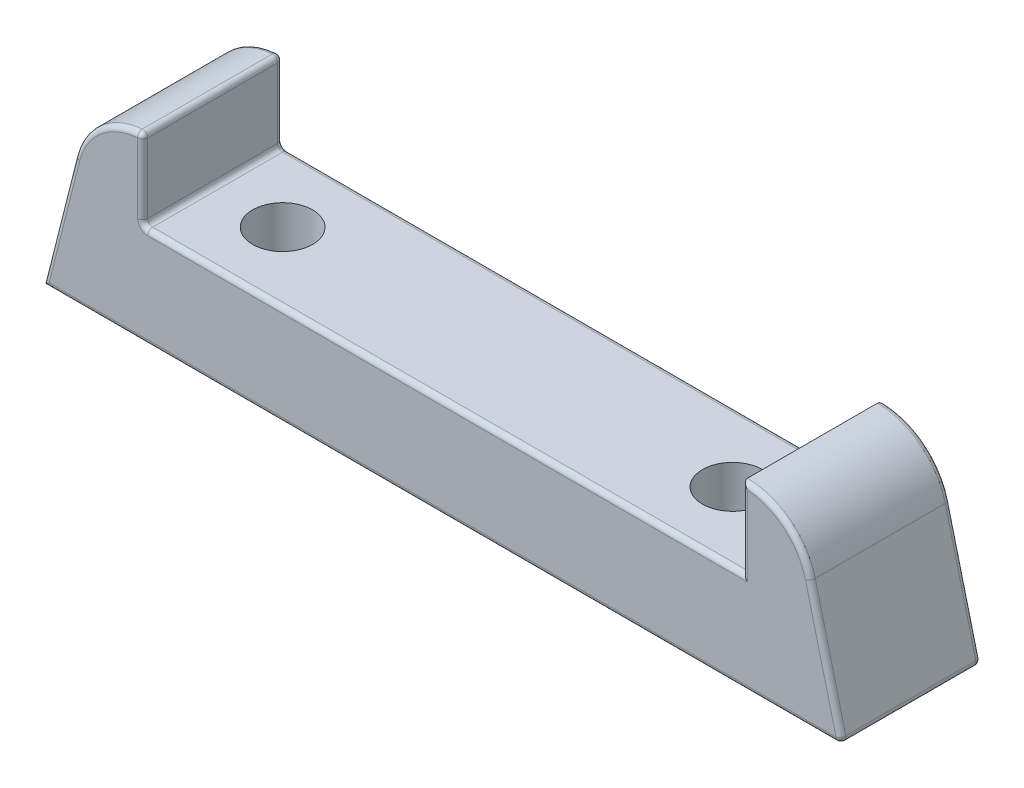
ISO-10303-21;
HEADER;
FILE_DESCRIPTION(('STEP AP214'),'2;1');
FILE_NAME('part.step','',(''),(''),'','','');
FILE_SCHEMA(('AUTOMOTIVE_DESIGN { 1 0 10303 214 1 1 1 1 }'));
ENDSEC;
DATA;
#1=APPLICATION_CONTEXT('core data for automotive mechanical design processes');
#2=APPLICATION_PROTOCOL_DEFINITION('international standard','automotive_design',2000,#1);
#3=PRODUCT_CONTEXT('',#1,'mechanical');
#4=PRODUCT('Part','Part','',(#3));
#5=PRODUCT_RELATED_PRODUCT_CATEGORY('part','',(#4));
#6=PRODUCT_DEFINITION_FORMATION('','',#4);
#7=PRODUCT_DEFINITION_CONTEXT('part definition',#1,'design');
#8=PRODUCT_DEFINITION('design','',#6,#7);
#9=PRODUCT_DEFINITION_SHAPE('','',#8);
#10=(LENGTH_UNIT() NAMED_UNIT(*) SI_UNIT(.MILLI.,.METRE.));
#11=(NAMED_UNIT(*) PLANE_ANGLE_UNIT() SI_UNIT($,.RADIAN.));
#12=(NAMED_UNIT(*) SI_UNIT($,.STERADIAN.) SOLID_ANGLE_UNIT());
#13=UNCERTAINTY_MEASURE_WITH_UNIT(LENGTH_MEASURE(1.E-05),#10,'distance_accuracy_value','');
#14=(GEOMETRIC_REPRESENTATION_CONTEXT(3) GLOBAL_UNCERTAINTY_ASSIGNED_CONTEXT((#13)) GLOBAL_UNIT_ASSIGNED_CONTEXT((#10,
#11,#12)) REPRESENTATION_CONTEXT('',''));
#15=CARTESIAN_POINT('',(0.,0.,0.));
#16=DIRECTION('',(0.,0.,1.));
#17=DIRECTION('',(1.,0.,0.));
#18=AXIS2_PLACEMENT_3D('',#15,#16,#17);
#19=CARTESIAN_POINT('',(-36.7866313698756,12.7151194271596,7.));
#20=DIRECTION('',(0.969518767125086,-0.245017061022806,0.));
#21=DIRECTION('',(0.245017061022806,0.969518767125086,0.));
#22=AXIS2_PLACEMENT_3D('',#19,#20,#21);
#23=PLANE('',#22);
#24=DIRECTION('',(0.,0.,-1.));
#25=VECTOR('',#24,1.);
#26=CARTESIAN_POINT('',(-36.7866313698756,12.7151194271596,7.));
#27=LINE('',#26,#25);
#28=CARTESIAN_POINT('',(-36.7866313698756,12.7151194271596,6.5));
#29=VERTEX_POINT('',#28);
#30=CARTESIAN_POINT('',(-36.7866313698756,12.7151194271596,-6.5));
#31=VERTEX_POINT('',#30);
#32=EDGE_CURVE('E490',#29,#31,#27,.T.);
#33=ORIENTED_EDGE('',*,*,#32,.T.);
#34=DIRECTION('',(-0.245017061022806,-0.969518767125086,0.));
#35=VECTOR('',#34,1.);
#36=CARTESIAN_POINT('',(-40.,0.,-6.5));
#37=LINE('',#36,#35);
#38=CARTESIAN_POINT('',(-40.,0.,-6.5));
#39=VERTEX_POINT('',#38);
#40=EDGE_CURVE('E192',#31,#39,#37,.T.);
#41=ORIENTED_EDGE('',*,*,#40,.T.);
#42=DIRECTION('',(0.,0.,-1.));
#43=VECTOR('',#42,1.);
#44=CARTESIAN_POINT('',(-40.,0.,7.));
#45=LINE('',#44,#43);
#46=CARTESIAN_POINT('',(-40.,0.,6.5));
#47=VERTEX_POINT('',#46);
#48=EDGE_CURVE('E177',#47,#39,#45,.T.);
#49=ORIENTED_EDGE('',*,*,#48,.F.);
#50=DIRECTION('',(-0.245017061022806,-0.969518767125086,0.));
#51=VECTOR('',#50,1.);
#52=CARTESIAN_POINT('',(-36.7866313698756,12.7151194271596,6.5));
#53=LINE('',#52,#51);
#54=EDGE_CURVE('E189',#47,#29,#53,.F.);
#55=ORIENTED_EDGE('',*,*,#54,.T.);
#56=EDGE_LOOP('',(#33,#41,#49,#55));
#57=FACE_BOUND('',#56,.T.);
#58=ADVANCED_FACE('F37',(#57),#23,.F.);
#59=CARTESIAN_POINT('',(-40.,0.,7.));
#60=DIRECTION('',(0.,1.,0.));
#61=DIRECTION('',(0.,0.,1.));
#62=AXIS2_PLACEMENT_3D('',#59,#60,#61);
#63=PLANE('',#62);
#64=CARTESIAN_POINT('',(-23.,0.,0.));
#65=DIRECTION('',(0.,1.,0.));
#66=DIRECTION('',(0.,0.,1.));
#67=AXIS2_PLACEMENT_3D('',#64,#65,#66);
#68=CIRCLE('',#67,3.);
#69=CARTESIAN_POINT('',(-23.,0.,3.));
#70=VERTEX_POINT('',#69);
#71=EDGE_CURVE('E529',#70,#70,#68,.T.);
#72=ORIENTED_EDGE('',*,*,#71,.T.);
#73=EDGE_LOOP('',(#72));
#74=FACE_BOUND('',#73,.T.);
#75=CARTESIAN_POINT('',(22.,0.,0.));
#76=DIRECTION('',(0.,1.,0.));
#77=DIRECTION('',(0.,0.,1.));
#78=AXIS2_PLACEMENT_3D('',#75,#76,#77);
#79=CIRCLE('',#78,3.);
#80=CARTESIAN_POINT('',(22.,0.,2.99999999999999));
#81=VERTEX_POINT('',#80);
#82=EDGE_CURVE('E531',#81,#81,#79,.T.);
#83=ORIENTED_EDGE('',*,*,#82,.T.);
#84=EDGE_LOOP('',(#83));
#85=FACE_BOUND('',#84,.T.);
#86=ORIENTED_EDGE('',*,*,#48,.T.);
#87=DIRECTION('',(1.,0.,0.));
#88=VECTOR('',#87,1.);
#89=CARTESIAN_POINT('',(40.,0.,-6.5));
#90=LINE('',#89,#88);
#91=CARTESIAN_POINT('',(39.3579200819832,0.,-6.5));
#92=VERTEX_POINT('',#91);
#93=EDGE_CURVE('E432',#39,#92,#90,.T.);
#94=ORIENTED_EDGE('',*,*,#93,.T.);
#95=DIRECTION('',(0.,0.,-1.));
#96=VECTOR('',#95,1.);
#97=CARTESIAN_POINT('',(39.3579200819832,0.,7.));
#98=LINE('',#97,#96);
#99=CARTESIAN_POINT('',(39.3579200819832,0.,6.5));
#100=VERTEX_POINT('',#99);
#101=EDGE_CURVE('E180',#92,#100,#98,.F.);
#102=ORIENTED_EDGE('',*,*,#101,.T.);
#103=DIRECTION('',(1.,0.,0.));
#104=VECTOR('',#103,1.);
#105=CARTESIAN_POINT('',(-40.,0.,6.5));
#106=LINE('',#105,#104);
#107=EDGE_CURVE('E173',#100,#47,#106,.F.);
#108=ORIENTED_EDGE('',*,*,#107,.T.);
#109=EDGE_LOOP('',(#86,#94,#102,#108));
#110=FACE_BOUND('',#109,.T.);
#111=ADVANCED_FACE('F175',(#74,#85,#110),#63,.F.);
#112=CARTESIAN_POINT('',(36.7866313698756,12.7151194271596,7.));
#113=DIRECTION('',(-0.969518767125086,-0.245017061022806,0.));
#114=DIRECTION('',(0.245017061022806,-0.969518767125086,0.));
#115=AXIS2_PLACEMENT_3D('',#112,#113,#114);
#116=PLANE('',#115);
#117=DIRECTION('',(0.,0.,-1.));
#118=VECTOR('',#117,1.);
#119=CARTESIAN_POINT('',(39.8426794655458,0.622508530511405,7.));
#120=LINE('',#119,#118);
#121=CARTESIAN_POINT('',(39.8426794655458,0.622508530511403,6.5));
#122=VERTEX_POINT('',#121);
#123=CARTESIAN_POINT('',(39.8426794655458,0.622508530511403,-6.5));
#124=VERTEX_POINT('',#123);
#125=EDGE_CURVE('E367',#122,#124,#120,.T.);
#126=ORIENTED_EDGE('',*,*,#125,.T.);
#127=DIRECTION('',(-0.245017061022806,0.969518767125086,0.));
#128=VECTOR('',#127,1.);
#129=CARTESIAN_POINT('',(36.7866313698756,12.7151194271596,-6.5));
#130=LINE('',#129,#128);
#131=CARTESIAN_POINT('',(36.7866313698756,12.7151194271596,-6.5));
#132=VERTEX_POINT('',#131);
#133=EDGE_CURVE('E369',#124,#132,#130,.T.);
#134=ORIENTED_EDGE('',*,*,#133,.T.);
#135=DIRECTION('',(0.,0.,-1.));
#136=VECTOR('',#135,1.);
#137=CARTESIAN_POINT('',(36.7866313698756,12.7151194271596,7.));
#138=LINE('',#137,#136);
#139=CARTESIAN_POINT('',(36.7866313698756,12.7151194271596,6.5));
#140=VERTEX_POINT('',#139);
#141=EDGE_CURVE('E193',#140,#132,#138,.T.);
#142=ORIENTED_EDGE('',*,*,#141,.F.);
#143=DIRECTION('',(-0.245017061022806,0.969518767125086,0.));
#144=VECTOR('',#143,1.);
#145=CARTESIAN_POINT('',(36.7866313698756,12.7151194271596,6.5));
#146=LINE('',#145,#144);
#147=EDGE_CURVE('E365',#140,#122,#146,.F.);
#148=ORIENTED_EDGE('',*,*,#147,.T.);
#149=EDGE_LOOP('',(#126,#134,#142,#148));
#150=FACE_BOUND('',#149,.T.);
#151=ADVANCED_FACE('F276',(#150),#116,.F.);
#152=CARTESIAN_POINT('',(30.,11.,7.));
#153=DIRECTION('',(0.,0.,-1.));
#154=DIRECTION('',(-1.,0.,0.));
#155=AXIS2_PLACEMENT_3D('',#152,#153,#154);
#156=CYLINDRICAL_SURFACE('',#155,7.);
#157=ORIENTED_EDGE('',*,*,#141,.T.);
#158=CARTESIAN_POINT('',(30.,11.,-6.5));
#159=DIRECTION('',(0.,0.,-1.));
#160=DIRECTION('',(-1.,0.,0.));
#161=AXIS2_PLACEMENT_3D('',#158,#159,#160);
#162=CIRCLE('',#161,7.);
#163=CARTESIAN_POINT('',(30.,18.,-6.5));
#164=VERTEX_POINT('',#163);
#165=EDGE_CURVE('E449',#132,#164,#162,.F.);
#166=ORIENTED_EDGE('',*,*,#165,.T.);
#167=DIRECTION('',(0.,0.,-1.));
#168=VECTOR('',#167,1.);
#169=CARTESIAN_POINT('',(30.,18.,7.));
#170=LINE('',#169,#168);
#171=CARTESIAN_POINT('',(30.,18.,6.5));
#172=VERTEX_POINT('',#171);
#173=EDGE_CURVE('E481',#172,#164,#170,.T.);
#174=ORIENTED_EDGE('',*,*,#173,.F.);
#175=CARTESIAN_POINT('',(30.,11.,6.5));
#176=DIRECTION('',(0.,0.,-1.));
#177=DIRECTION('',(-1.,0.,0.));
#178=AXIS2_PLACEMENT_3D('',#175,#176,#177);
#179=CIRCLE('',#178,7.);
#180=EDGE_CURVE('E447',#172,#140,#179,.T.);
#181=ORIENTED_EDGE('',*,*,#180,.T.);
#182=EDGE_LOOP('',(#157,#166,#174,#181));
#183=FACE_BOUND('',#182,.T.);
#184=ADVANCED_FACE('F485',(#183),#156,.T.);
#185=CARTESIAN_POINT('',(30.,10.,7.));
#186=DIRECTION('',(1.,0.,0.));
#187=DIRECTION('',(0.,0.,-1.));
#188=AXIS2_PLACEMENT_3D('',#185,#186,#187);
#189=PLANE('',#188);
#190=ORIENTED_EDGE('',*,*,#173,.T.);
#191=DIRECTION('',(0.,-1.,0.));
#192=VECTOR('',#191,1.);
#193=CARTESIAN_POINT('',(30.,10.,-6.5));
#194=LINE('',#193,#192);
#195=CARTESIAN_POINT('',(30.,10.,-6.5));
#196=VERTEX_POINT('',#195);
#197=EDGE_CURVE('E340',#164,#196,#194,.T.);
#198=ORIENTED_EDGE('',*,*,#197,.T.);
#199=DIRECTION('',(0.,0.,-1.));
#200=VECTOR('',#199,1.);
#201=CARTESIAN_POINT('',(30.,10.,7.));
#202=LINE('',#201,#200);
#203=CARTESIAN_POINT('',(30.,10.,6.5));
#204=VERTEX_POINT('',#203);
#205=EDGE_CURVE('E482',#204,#196,#202,.T.);
#206=ORIENTED_EDGE('',*,*,#205,.F.);
#207=DIRECTION('',(0.,-1.,0.));
#208=VECTOR('',#207,1.);
#209=CARTESIAN_POINT('',(30.,10.,6.5));
#210=LINE('',#209,#208);
#211=EDGE_CURVE('E451',#204,#172,#210,.F.);
#212=ORIENTED_EDGE('',*,*,#211,.T.);
#213=EDGE_LOOP('',(#190,#198,#206,#212));
#214=FACE_BOUND('',#213,.T.);
#215=ADVANCED_FACE('F480',(#214),#189,.F.);
#216=CARTESIAN_POINT('',(30.,10.,7.));
#217=DIRECTION('',(0.,-1.,0.));
#218=DIRECTION('',(0.,0.,-1.));
#219=AXIS2_PLACEMENT_3D('',#216,#217,#218);
#220=PLANE('',#219);
#221=ORIENTED_EDGE('',*,*,#205,.T.);
#222=DIRECTION('',(-1.,0.,0.));
#223=VECTOR('',#222,1.);
#224=CARTESIAN_POINT('',(-30.,10.,-6.5));
#225=LINE('',#224,#223);
#226=CARTESIAN_POINT('',(-29.5,10.,-6.5));
#227=VERTEX_POINT('',#226);
#228=EDGE_CURVE('E348',#196,#227,#225,.T.);
#229=ORIENTED_EDGE('',*,*,#228,.T.);
#230=DIRECTION('',(0.,0.,-1.));
#231=VECTOR('',#230,1.);
#232=CARTESIAN_POINT('',(-29.5,10.,7.));
#233=LINE('',#232,#231);
#234=CARTESIAN_POINT('',(-29.5,10.,6.5));
#235=VERTEX_POINT('',#234);
#236=EDGE_CURVE('E358',#227,#235,#233,.F.);
#237=ORIENTED_EDGE('',*,*,#236,.T.);
#238=DIRECTION('',(-1.,0.,0.));
#239=VECTOR('',#238,1.);
#240=CARTESIAN_POINT('',(30.,10.,6.5));
#241=LINE('',#240,#239);
#242=EDGE_CURVE('E354',#235,#204,#241,.F.);
#243=ORIENTED_EDGE('',*,*,#242,.T.);
#244=EDGE_LOOP('',(#221,#229,#237,#243));
#245=FACE_BOUND('',#244,.T.);
#246=CARTESIAN_POINT('',(-23.,10.,0.));
#247=DIRECTION('',(0.,1.,0.));
#248=DIRECTION('',(0.,0.,1.));
#249=AXIS2_PLACEMENT_3D('',#246,#247,#248);
#250=CIRCLE('',#249,3.);
#251=CARTESIAN_POINT('',(-23.,10.,3.));
#252=VERTEX_POINT('',#251);
#253=EDGE_CURVE('E536',#252,#252,#250,.T.);
#254=ORIENTED_EDGE('',*,*,#253,.F.);
#255=EDGE_LOOP('',(#254));
#256=FACE_BOUND('',#255,.T.);
#257=CARTESIAN_POINT('',(22.,10.,0.));
#258=DIRECTION('',(0.,1.,0.));
#259=DIRECTION('',(0.,0.,1.));
#260=AXIS2_PLACEMENT_3D('',#257,#258,#259);
#261=CIRCLE('',#260,3.);
#262=CARTESIAN_POINT('',(22.,10.,2.99999999999999));
#263=VERTEX_POINT('',#262);
#264=EDGE_CURVE('E467',#263,#263,#261,.T.);
#265=ORIENTED_EDGE('',*,*,#264,.F.);
#266=EDGE_LOOP('',(#265));
#267=FACE_BOUND('',#266,.T.);
#268=ADVANCED_FACE('F454',(#245,#256,#267),#220,.F.);
#269=CARTESIAN_POINT('',(-30.,10.,7.));
#270=DIRECTION('',(-1.,0.,0.));
#271=DIRECTION('',(0.,0.,1.));
#272=AXIS2_PLACEMENT_3D('',#269,#270,#271);
#273=PLANE('',#272);
#274=DIRECTION('',(0.,1.,0.));
#275=VECTOR('',#274,1.);
#276=CARTESIAN_POINT('',(-30.,10.,6.5));
#277=LINE('',#276,#275);
#278=CARTESIAN_POINT('',(-30.,17.4807406984079,6.5));
#279=VERTEX_POINT('',#278);
#280=CARTESIAN_POINT('',(-30.,10.5,6.5));
#281=VERTEX_POINT('',#280);
#282=EDGE_CURVE('E46',#279,#281,#277,.F.);
#283=ORIENTED_EDGE('',*,*,#282,.T.);
#284=DIRECTION('',(0.,0.,-1.));
#285=VECTOR('',#284,1.);
#286=CARTESIAN_POINT('',(-30.,10.5,-7.));
#287=LINE('',#286,#285);
#288=CARTESIAN_POINT('',(-30.,10.5,-6.5));
#289=VERTEX_POINT('',#288);
#290=EDGE_CURVE('E11',#281,#289,#287,.T.);
#291=ORIENTED_EDGE('',*,*,#290,.T.);
#292=DIRECTION('',(0.,1.,0.));
#293=VECTOR('',#292,1.);
#294=CARTESIAN_POINT('',(-30.,18.,-6.5));
#295=LINE('',#294,#293);
#296=CARTESIAN_POINT('',(-30.,17.4807406984079,-6.5));
#297=VERTEX_POINT('',#296);
#298=EDGE_CURVE('E390',#289,#297,#295,.T.);
#299=ORIENTED_EDGE('',*,*,#298,.T.);
#300=DIRECTION('',(0.,0.,-1.));
#301=VECTOR('',#300,1.);
#302=CARTESIAN_POINT('',(-30.,17.4807406984079,7.));
#303=LINE('',#302,#301);
#304=EDGE_CURVE('E57',#297,#279,#303,.F.);
#305=ORIENTED_EDGE('',*,*,#304,.T.);
#306=EDGE_LOOP('',(#283,#291,#299,#305));
#307=FACE_BOUND('',#306,.T.);
#308=ADVANCED_FACE('F545',(#307),#273,.F.);
#309=CARTESIAN_POINT('',(-30.,11.,7.));
#310=DIRECTION('',(0.,0.,-1.));
#311=DIRECTION('',(-1.,0.,0.));
#312=AXIS2_PLACEMENT_3D('',#309,#310,#311);
#313=CYLINDRICAL_SURFACE('',#312,7.);
#314=DIRECTION('',(0.,0.,-1.));
#315=VECTOR('',#314,1.);
#316=CARTESIAN_POINT('',(-30.5384615384615,17.97925921367,7.));
#317=LINE('',#316,#315);
#318=CARTESIAN_POINT('',(-30.5384615384615,17.97925921367,6.5));
#319=VERTEX_POINT('',#318);
#320=CARTESIAN_POINT('',(-30.5384615384615,17.97925921367,-6.5));
#321=VERTEX_POINT('',#320);
#322=EDGE_CURVE('E353',#319,#321,#317,.T.);
#323=ORIENTED_EDGE('',*,*,#322,.T.);
#324=CARTESIAN_POINT('',(-30.,11.,-6.5));
#325=DIRECTION('',(0.,0.,-1.));
#326=DIRECTION('',(-1.,0.,0.));
#327=AXIS2_PLACEMENT_3D('',#324,#325,#326);
#328=CIRCLE('',#327,7.);
#329=EDGE_CURVE('E203',#321,#31,#328,.F.);
#330=ORIENTED_EDGE('',*,*,#329,.T.);
#331=ORIENTED_EDGE('',*,*,#32,.F.);
#332=CARTESIAN_POINT('',(-30.,11.,6.5));
#333=DIRECTION('',(0.,0.,-1.));
#334=DIRECTION('',(-1.,0.,0.));
#335=AXIS2_PLACEMENT_3D('',#332,#333,#334);
#336=CIRCLE('',#335,7.);
#337=EDGE_CURVE('E356',#29,#319,#336,.T.);
#338=ORIENTED_EDGE('',*,*,#337,.T.);
#339=EDGE_LOOP('',(#323,#330,#331,#338));
#340=FACE_BOUND('',#339,.T.);
#341=ADVANCED_FACE('F528',(#340),#313,.T.);
#342=CARTESIAN_POINT('',(30.,11.,7.));
#343=DIRECTION('',(0.,0.,-1.));
#344=DIRECTION('',(-1.,0.,0.));
#345=AXIS2_PLACEMENT_3D('',#342,#343,#344);
#346=PLANE('',#345);
#347=CARTESIAN_POINT('',(30.,11.,7.));
#348=DIRECTION('',(0.,0.,-1.));
#349=DIRECTION('',(-1.,0.,0.));
#350=AXIS2_PLACEMENT_3D('',#347,#348,#349);
#351=CIRCLE('',#350,6.5);
#352=CARTESIAN_POINT('',(36.3018719863131,12.5926108966482,7.));
#353=VERTEX_POINT('',#352);
#354=CARTESIAN_POINT('',(30.5,17.4807406984079,7.));
#355=VERTEX_POINT('',#354);
#356=EDGE_CURVE('E386',#353,#355,#351,.F.);
#357=ORIENTED_EDGE('',*,*,#356,.T.);
#358=DIRECTION('',(0.,-1.,0.));
#359=VECTOR('',#358,1.);
#360=CARTESIAN_POINT('',(30.5,11.,7.));
#361=LINE('',#360,#359);
#362=CARTESIAN_POINT('',(30.5,9.5,7.));
#363=VERTEX_POINT('',#362);
#364=EDGE_CURVE('E388',#355,#363,#361,.T.);
#365=ORIENTED_EDGE('',*,*,#364,.T.);
#366=DIRECTION('',(-1.,0.,0.));
#367=VECTOR('',#366,1.);
#368=CARTESIAN_POINT('',(30.,9.5,7.));
#369=LINE('',#368,#367);
#370=CARTESIAN_POINT('',(-29.5,9.5,7.));
#371=VERTEX_POINT('',#370);
#372=EDGE_CURVE('E376',#363,#371,#369,.T.);
#373=ORIENTED_EDGE('',*,*,#372,.T.);
#374=CARTESIAN_POINT('',(-29.5,10.5,7.));
#375=DIRECTION('',(0.,0.,-1.));
#376=DIRECTION('',(-1.,0.,0.));
#377=AXIS2_PLACEMENT_3D('',#374,#375,#376);
#378=CIRCLE('',#377,1.);
#379=CARTESIAN_POINT('',(-30.5,10.5,7.));
#380=VERTEX_POINT('',#379);
#381=EDGE_CURVE('E373',#380,#371,#378,.F.);
#382=ORIENTED_EDGE('',*,*,#381,.F.);
#383=DIRECTION('',(0.,1.,0.));
#384=VECTOR('',#383,1.);
#385=CARTESIAN_POINT('',(-30.5,11.,7.));
#386=LINE('',#385,#384);
#387=CARTESIAN_POINT('',(-30.5,17.4807406984079,7.));
#388=VERTEX_POINT('',#387);
#389=EDGE_CURVE('E371',#380,#388,#386,.T.);
#390=ORIENTED_EDGE('',*,*,#389,.T.);
#391=CARTESIAN_POINT('',(-30.,11.,7.));
#392=DIRECTION('',(0.,0.,-1.));
#393=DIRECTION('',(-1.,0.,0.));
#394=AXIS2_PLACEMENT_3D('',#391,#392,#393);
#395=CIRCLE('',#394,6.5);
#396=CARTESIAN_POINT('',(-36.3018719863131,12.5926108966482,7.));
#397=VERTEX_POINT('',#396);
#398=EDGE_CURVE('E378',#388,#397,#395,.F.);
#399=ORIENTED_EDGE('',*,*,#398,.T.);
#400=DIRECTION('',(-0.245017061022806,-0.969518767125086,0.));
#401=VECTOR('',#400,1.);
#402=CARTESIAN_POINT('',(-32.6998703747779,26.8455292322948,7.));
#403=LINE('',#402,#401);
#404=CARTESIAN_POINT('',(-39.3579200819832,0.5,7.));
#405=VERTEX_POINT('',#404);
#406=EDGE_CURVE('E381',#397,#405,#403,.T.);
#407=ORIENTED_EDGE('',*,*,#406,.T.);
#408=DIRECTION('',(1.,0.,0.));
#409=VECTOR('',#408,1.);
#410=CARTESIAN_POINT('',(30.,0.5,7.));
#411=LINE('',#410,#409);
#412=CARTESIAN_POINT('',(39.3579200819832,0.5,7.));
#413=VERTEX_POINT('',#412);
#414=EDGE_CURVE('E206',#405,#413,#411,.T.);
#415=ORIENTED_EDGE('',*,*,#414,.T.);
#416=DIRECTION('',(-0.245017061022806,0.969518767125086,0.));
#417=VECTOR('',#416,1.);
#418=CARTESIAN_POINT('',(36.3018719863131,12.5926108966482,7.));
#419=LINE('',#418,#417);
#420=EDGE_CURVE('E384',#413,#353,#419,.T.);
#421=ORIENTED_EDGE('',*,*,#420,.T.);
#422=EDGE_LOOP('',(#357,#365,#373,#382,#390,#399,#407,#415,#421));
#423=FACE_BOUND('',#422,.T.);
#424=ADVANCED_FACE('F520',(#423),#346,.F.);
#425=CARTESIAN_POINT('',(30.,11.,-7.));
#426=DIRECTION('',(0.,0.,-1.));
#427=DIRECTION('',(-1.,0.,0.));
#428=AXIS2_PLACEMENT_3D('',#425,#426,#427);
#429=PLANE('',#428);
#430=DIRECTION('',(-0.245017061022806,0.969518767125086,0.));
#431=VECTOR('',#430,1.);
#432=CARTESIAN_POINT('',(39.5152406164375,-0.122508530511403,-7.));
#433=LINE('',#432,#431);
#434=CARTESIAN_POINT('',(36.3018719863131,12.5926108966482,-7.));
#435=VERTEX_POINT('',#434);
#436=CARTESIAN_POINT('',(39.3579200819832,0.5,-7.));
#437=VERTEX_POINT('',#436);
#438=EDGE_CURVE('E440',#435,#437,#433,.F.);
#439=ORIENTED_EDGE('',*,*,#438,.T.);
#440=DIRECTION('',(1.,0.,0.));
#441=VECTOR('',#440,1.);
#442=CARTESIAN_POINT('',(-40.,0.5,-7.));
#443=LINE('',#442,#441);
#444=CARTESIAN_POINT('',(-39.3579200819832,0.5,-7.));
#445=VERTEX_POINT('',#444);
#446=EDGE_CURVE('E444',#437,#445,#443,.F.);
#447=ORIENTED_EDGE('',*,*,#446,.T.);
#448=DIRECTION('',(-0.245017061022806,-0.969518767125086,0.));
#449=VECTOR('',#448,1.);
#450=CARTESIAN_POINT('',(-36.3018719863131,12.5926108966482,-7.));
#451=LINE('',#450,#449);
#452=CARTESIAN_POINT('',(-36.3018719863131,12.5926108966482,-7.));
#453=VERTEX_POINT('',#452);
#454=EDGE_CURVE('E442',#445,#453,#451,.F.);
#455=ORIENTED_EDGE('',*,*,#454,.T.);
#456=CARTESIAN_POINT('',(-30.,11.,-7.));
#457=DIRECTION('',(0.,0.,-1.));
#458=DIRECTION('',(-1.,0.,0.));
#459=AXIS2_PLACEMENT_3D('',#456,#457,#458);
#460=CIRCLE('',#459,6.5);
#461=CARTESIAN_POINT('',(-30.5,17.4807406984079,-7.));
#462=VERTEX_POINT('',#461);
#463=EDGE_CURVE('E418',#453,#462,#460,.T.);
#464=ORIENTED_EDGE('',*,*,#463,.T.);
#465=DIRECTION('',(0.,1.,0.));
#466=VECTOR('',#465,1.);
#467=CARTESIAN_POINT('',(-30.5,10.,-7.));
#468=LINE('',#467,#466);
#469=CARTESIAN_POINT('',(-30.5,10.5,-7.));
#470=VERTEX_POINT('',#469);
#471=EDGE_CURVE('E426',#462,#470,#468,.F.);
#472=ORIENTED_EDGE('',*,*,#471,.T.);
#473=CARTESIAN_POINT('',(-29.5,10.5,-7.));
#474=DIRECTION('',(0.,0.,-1.));
#475=DIRECTION('',(-1.,0.,0.));
#476=AXIS2_PLACEMENT_3D('',#473,#474,#475);
#477=CIRCLE('',#476,1.);
#478=CARTESIAN_POINT('',(-29.5,9.5,-7.));
#479=VERTEX_POINT('',#478);
#480=EDGE_CURVE('E429',#479,#470,#477,.T.);
#481=ORIENTED_EDGE('',*,*,#480,.F.);
#482=DIRECTION('',(-1.,0.,0.));
#483=VECTOR('',#482,1.);
#484=CARTESIAN_POINT('',(30.,9.5,-7.));
#485=LINE('',#484,#483);
#486=CARTESIAN_POINT('',(30.5,9.5,-7.));
#487=VERTEX_POINT('',#486);
#488=EDGE_CURVE('E347',#479,#487,#485,.F.);
#489=ORIENTED_EDGE('',*,*,#488,.T.);
#490=DIRECTION('',(0.,-1.,0.));
#491=VECTOR('',#490,1.);
#492=CARTESIAN_POINT('',(30.5,18.,-7.));
#493=LINE('',#492,#491);
#494=CARTESIAN_POINT('',(30.5,17.4807406984079,-7.));
#495=VERTEX_POINT('',#494);
#496=EDGE_CURVE('E342',#487,#495,#493,.F.);
#497=ORIENTED_EDGE('',*,*,#496,.T.);
#498=CARTESIAN_POINT('',(30.,11.,-7.));
#499=DIRECTION('',(0.,0.,-1.));
#500=DIRECTION('',(-1.,0.,0.));
#501=AXIS2_PLACEMENT_3D('',#498,#499,#500);
#502=CIRCLE('',#501,6.5);
#503=EDGE_CURVE('E438',#495,#435,#502,.T.);
#504=ORIENTED_EDGE('',*,*,#503,.T.);
#505=EDGE_LOOP('',(#439,#447,#455,#464,#472,#481,#489,#497,#504));
#506=FACE_BOUND('',#505,.T.);
#507=ADVANCED_FACE('F508',(#506),#429,.T.);
#508=CARTESIAN_POINT('',(22.,-4.,0.));
#509=DIRECTION('',(0.,1.,0.));
#510=DIRECTION('',(0.,0.,1.));
#511=AXIS2_PLACEMENT_3D('',#508,#509,#510);
#512=CYLINDRICAL_SURFACE('',#511,3.);
#513=ORIENTED_EDGE('',*,*,#264,.T.);
#514=EDGE_LOOP('',(#513));
#515=FACE_BOUND('',#514,.T.);
#516=ORIENTED_EDGE('',*,*,#82,.F.);
#517=EDGE_LOOP('',(#516));
#518=FACE_BOUND('',#517,.T.);
#519=ADVANCED_FACE('F549',(#515,#518),#512,.F.);
#520=CARTESIAN_POINT('',(-23.,-4.,0.));
#521=DIRECTION('',(0.,1.,0.));
#522=DIRECTION('',(0.,0.,1.));
#523=AXIS2_PLACEMENT_3D('',#520,#521,#522);
#524=CYLINDRICAL_SURFACE('',#523,3.);
#525=ORIENTED_EDGE('',*,*,#253,.T.);
#526=EDGE_LOOP('',(#525));
#527=FACE_BOUND('',#526,.T.);
#528=ORIENTED_EDGE('',*,*,#71,.F.);
#529=EDGE_LOOP('',(#528));
#530=FACE_BOUND('',#529,.T.);
#531=ADVANCED_FACE('F268',(#527,#530),#524,.F.);
#532=CARTESIAN_POINT('',(-29.5,10.5,6.5));
#533=DIRECTION('',(0.,0.,-1.));
#534=DIRECTION('',(-1.,0.,0.));
#535=AXIS2_PLACEMENT_3D('',#532,#533,#534);
#536=TOROIDAL_SURFACE('',#535,1.,0.5);
#537=CARTESIAN_POINT('',(-30.5,10.5,6.5));
#538=DIRECTION('',(0.,-1.,0.));
#539=DIRECTION('',(0.,0.,-1.));
#540=AXIS2_PLACEMENT_3D('',#537,#538,#539);
#541=CIRCLE('',#540,0.5);
#542=EDGE_CURVE('E465',#380,#281,#541,.F.);
#543=ORIENTED_EDGE('',*,*,#542,.F.);
#544=ORIENTED_EDGE('',*,*,#381,.T.);
#545=CARTESIAN_POINT('',(-29.5,9.5,6.5));
#546=DIRECTION('',(-1.,0.,0.));
#547=DIRECTION('',(0.,0.,1.));
#548=AXIS2_PLACEMENT_3D('',#545,#546,#547);
#549=CIRCLE('',#548,0.5);
#550=EDGE_CURVE('E41',#235,#371,#549,.F.);
#551=ORIENTED_EDGE('',*,*,#550,.F.);
#552=CARTESIAN_POINT('',(-29.5,10.5,6.5));
#553=DIRECTION('',(0.,0.,-1.));
#554=DIRECTION('',(-1.,0.,0.));
#555=AXIS2_PLACEMENT_3D('',#552,#553,#554);
#556=CIRCLE('',#555,0.5);
#557=EDGE_CURVE('E462',#281,#235,#556,.F.);
#558=ORIENTED_EDGE('',*,*,#557,.F.);
#559=EDGE_LOOP('',(#543,#544,#551,#558));
#560=FACE_BOUND('',#559,.T.);
#561=ADVANCED_FACE('F39',(#560),#536,.T.);
#562=CARTESIAN_POINT('',(30.,9.5,6.5));
#563=DIRECTION('',(-1.,0.,0.));
#564=DIRECTION('',(0.,0.,1.));
#565=AXIS2_PLACEMENT_3D('',#562,#563,#564);
#566=CYLINDRICAL_SURFACE('',#565,0.5);
#567=ORIENTED_EDGE('',*,*,#550,.T.);
#568=ORIENTED_EDGE('',*,*,#372,.F.);
#569=CARTESIAN_POINT('',(30.5,9.5,6.5));
#570=DIRECTION('',(-0.707106781186547,-0.707106781186547,0.));
#571=DIRECTION('',(-0.707106781186547,0.707106781186547,0.));
#572=AXIS2_PLACEMENT_3D('',#569,#570,#571);
#573=ELLIPSE('',#572,0.707106781186547,0.5);
#574=EDGE_CURVE('E470',#204,#363,#573,.F.);
#575=ORIENTED_EDGE('',*,*,#574,.F.);
#576=ORIENTED_EDGE('',*,*,#242,.F.);
#577=EDGE_LOOP('',(#567,#568,#575,#576));
#578=FACE_BOUND('',#577,.T.);
#579=ADVANCED_FACE('F261',(#578),#566,.T.);
#580=CARTESIAN_POINT('',(-29.5,10.5,7.));
#581=DIRECTION('',(0.,0.,1.));
#582=DIRECTION('',(1.,0.,0.));
#583=AXIS2_PLACEMENT_3D('',#580,#581,#582);
#584=CYLINDRICAL_SURFACE('',#583,0.5);
#585=ORIENTED_EDGE('',*,*,#557,.T.);
#586=ORIENTED_EDGE('',*,*,#236,.F.);
#587=CARTESIAN_POINT('',(-29.5,10.5,-6.5));
#588=DIRECTION('',(0.,0.,-1.));
#589=DIRECTION('',(-1.,0.,0.));
#590=AXIS2_PLACEMENT_3D('',#587,#588,#589);
#591=CIRCLE('',#590,0.5);
#592=EDGE_CURVE('E473',#289,#227,#591,.F.);
#593=ORIENTED_EDGE('',*,*,#592,.F.);
#594=ORIENTED_EDGE('',*,*,#290,.F.);
#595=EDGE_LOOP('',(#585,#586,#593,#594));
#596=FACE_BOUND('',#595,.T.);
#597=ADVANCED_FACE('F258',(#596),#584,.F.);
#598=CARTESIAN_POINT('',(-30.5,11.,6.5));
#599=DIRECTION('',(0.,1.,0.));
#600=DIRECTION('',(0.,0.,1.));
#601=AXIS2_PLACEMENT_3D('',#598,#599,#600);
#602=CYLINDRICAL_SURFACE('',#601,0.5);
#603=ORIENTED_EDGE('',*,*,#542,.T.);
#604=ORIENTED_EDGE('',*,*,#282,.F.);
#605=CARTESIAN_POINT('',(-30.5,17.4807406984079,6.5));
#606=DIRECTION('',(0.,1.,0.));
#607=DIRECTION('',(0.,0.,1.));
#608=AXIS2_PLACEMENT_3D('',#605,#606,#607);
#609=CIRCLE('',#608,0.5);
#610=EDGE_CURVE('E509',#388,#279,#609,.T.);
#611=ORIENTED_EDGE('',*,*,#610,.F.);
#612=ORIENTED_EDGE('',*,*,#389,.F.);
#613=EDGE_LOOP('',(#603,#604,#611,#612));
#614=FACE_BOUND('',#613,.T.);
#615=ADVANCED_FACE('F254',(#614),#602,.T.);
#616=CARTESIAN_POINT('',(-30.,11.,6.5));
#617=DIRECTION('',(0.,0.,-1.));
#618=DIRECTION('',(-1.,0.,0.));
#619=AXIS2_PLACEMENT_3D('',#616,#617,#618);
#620=TOROIDAL_SURFACE('',#619,6.5,0.5);
#621=CARTESIAN_POINT('',(-36.3018719863131,12.5926108966482,6.5));
#622=DIRECTION('',(-0.245017061022804,-0.969518767125086,0.));
#623=DIRECTION('',(0.969518767125086,-0.245017061022805,0.));
#624=AXIS2_PLACEMENT_3D('',#621,#622,#623);
#625=CIRCLE('',#624,0.5);
#626=EDGE_CURVE('E202',#397,#29,#625,.T.);
#627=ORIENTED_EDGE('',*,*,#626,.F.);
#628=ORIENTED_EDGE('',*,*,#398,.F.);
#629=CARTESIAN_POINT('',(-30.5,17.4807406984079,6.5));
#630=DIRECTION('',(0.997037030524286,0.0769230769230788,0.));
#631=DIRECTION('',(-0.0769230769230788,0.997037030524286,0.));
#632=AXIS2_PLACEMENT_3D('',#629,#630,#631);
#633=CIRCLE('',#632,0.5);
#634=EDGE_CURVE('E512',#319,#388,#633,.T.);
#635=ORIENTED_EDGE('',*,*,#634,.F.);
#636=ORIENTED_EDGE('',*,*,#337,.F.);
#637=EDGE_LOOP('',(#627,#628,#635,#636));
#638=FACE_BOUND('',#637,.T.);
#639=ADVANCED_FACE('F241',(#638),#620,.T.);
#640=CARTESIAN_POINT('',(30.5,11.,6.5));
#641=DIRECTION('',(0.,-1.,0.));
#642=DIRECTION('',(0.,0.,-1.));
#643=AXIS2_PLACEMENT_3D('',#640,#641,#642);
#644=CYLINDRICAL_SURFACE('',#643,0.5);
#645=ORIENTED_EDGE('',*,*,#574,.T.);
#646=ORIENTED_EDGE('',*,*,#364,.F.);
#647=CARTESIAN_POINT('',(30.,18.,6.5));
#648=CARTESIAN_POINT('',(29.9999621521393,18.0000361923946,6.52237601982577));
#649=CARTESIAN_POINT('',(30.0014994222044,17.9985006223106,6.54469725895587));
#650=CARTESIAN_POINT('',(30.0073964643991,17.9926006594141,6.58839237304748));
#651=CARTESIAN_POINT('',(30.0117321671512,17.9882603895092,6.60977268132142));
#652=CARTESIAN_POINT('',(30.0228934962934,17.9770710220767,6.6510958180562));
#653=CARTESIAN_POINT('',(30.0297125801469,17.9702285165641,6.6710422602403));
#654=CARTESIAN_POINT('',(30.0454183045125,17.9544379155765,6.70924332007298));
#655=CARTESIAN_POINT('',(30.0543094477307,17.945485234076,6.72749413044501));
#656=CARTESIAN_POINT('',(30.0776215537614,17.9219567182402,6.76901284009348));
#657=CARTESIAN_POINT('',(30.0928327661821,17.9065631724305,6.79137293364597));
#658=CARTESIAN_POINT('',(30.1255069205252,17.8733674798974,6.83233145447826));
#659=CARTESIAN_POINT('',(30.1429740455362,17.8555608555553,6.85092272448774));
#660=CARTESIAN_POINT('',(30.1867444866212,17.8107456975508,6.89125090134462));
#661=CARTESIAN_POINT('',(30.2137839143773,17.782909018718,6.91126319608049));
#662=CARTESIAN_POINT('',(30.2695158052172,17.7251481281674,6.94490315770279));
#663=CARTESIAN_POINT('',(30.2982105307981,17.6952210468772,6.95852184180225));
#664=CARTESIAN_POINT('',(30.3552139081312,17.6353497263042,6.97950107165007));
#665=CARTESIAN_POINT('',(30.383491661804,17.6054545986916,6.98709131094408));
#666=CARTESIAN_POINT('',(30.4402085632146,17.5450736685167,6.99724521413119));
#667=CARTESIAN_POINT('',(30.4686472920237,17.5145891228081,6.99981858991763));
#668=CARTESIAN_POINT('',(30.4979714065641,17.4829315536351,6.99999690863496));
#669=CARTESIAN_POINT('',(30.4989857916815,17.4818361702912,6.999999994076));
#670=CARTESIAN_POINT('',(30.5,17.4807406984079,7.));
#671=B_SPLINE_CURVE_WITH_KNOTS('',3,(#647,#648,#649,#650,#651,#652,#653,#654,#655,#656,#657,
#658,#659,#660,#661,#662,#663,#664,#665,#666,#667,#668,#669,#670),.UNSPECIFIED.,.F.,.F.,(4,2,2,
2,2,2,2,2,2,2,2,4),(0.,0.0669359368622374,0.133303692691635,0.199497850934215,0.265837216786812,
0.358674295805165,0.451686060812473,0.581967999096278,0.712432434930365,0.837649048743519,
0.962623020373122,0.967101806102504),.UNSPECIFIED.);
#672=EDGE_CURVE('E223',#172,#355,#671,.T.);
#673=ORIENTED_EDGE('',*,*,#672,.F.);
#674=ORIENTED_EDGE('',*,*,#211,.F.);
#675=EDGE_LOOP('',(#645,#646,#673,#674));
#676=FACE_BOUND('',#675,.T.);
#677=ADVANCED_FACE('F236',(#676),#644,.T.);
#678=CARTESIAN_POINT('',(-29.5,10.5,-6.5));
#679=DIRECTION('',(0.,0.,-1.));
#680=DIRECTION('',(-1.,0.,0.));
#681=AXIS2_PLACEMENT_3D('',#678,#679,#680);
#682=TOROIDAL_SURFACE('',#681,1.,0.5);
#683=CARTESIAN_POINT('',(-30.5,10.5,-6.5));
#684=DIRECTION('',(0.,-1.,0.));
#685=DIRECTION('',(0.,0.,-1.));
#686=AXIS2_PLACEMENT_3D('',#683,#684,#685);
#687=CIRCLE('',#686,0.5);
#688=EDGE_CURVE('E211',#289,#470,#687,.F.);
#689=ORIENTED_EDGE('',*,*,#688,.F.);
#690=ORIENTED_EDGE('',*,*,#592,.T.);
#691=CARTESIAN_POINT('',(-29.5,9.5,-6.5));
#692=DIRECTION('',(-1.,0.,0.));
#693=DIRECTION('',(0.,0.,1.));
#694=AXIS2_PLACEMENT_3D('',#691,#692,#693);
#695=CIRCLE('',#694,0.5);
#696=EDGE_CURVE('E220',#479,#227,#695,.F.);
#697=ORIENTED_EDGE('',*,*,#696,.F.);
#698=ORIENTED_EDGE('',*,*,#480,.T.);
#699=EDGE_LOOP('',(#689,#690,#697,#698));
#700=FACE_BOUND('',#699,.T.);
#701=ADVANCED_FACE('F240',(#700),#682,.T.);
#702=CARTESIAN_POINT('',(-30.5,17.4807406984079,6.5));
#703=DIRECTION('',(0.,0.,1.));
#704=DIRECTION('',(1.,0.,0.));
#705=AXIS2_PLACEMENT_3D('',#702,#703,#704);
#706=SPHERICAL_SURFACE('',#705,0.5);
#707=ORIENTED_EDGE('',*,*,#634,.T.);
#708=ORIENTED_EDGE('',*,*,#610,.T.);
#709=CARTESIAN_POINT('',(-30.5,17.4807406984079,6.5));
#710=DIRECTION('',(0.,0.,1.));
#711=DIRECTION('',(1.,0.,0.));
#712=AXIS2_PLACEMENT_3D('',#709,#710,#711);
#713=CIRCLE('',#712,0.5);
#714=EDGE_CURVE('E207',#319,#279,#713,.F.);
#715=ORIENTED_EDGE('',*,*,#714,.F.);
#716=EDGE_LOOP('',(#707,#708,#715));
#717=FACE_BOUND('',#716,.T.);
#718=ADVANCED_FACE('F245',(#717),#706,.T.);
#719=CARTESIAN_POINT('',(-32.6998703747779,26.8455292322948,6.5));
#720=DIRECTION('',(-0.245017061022806,-0.969518767125086,0.));
#721=DIRECTION('',(0.969518767125086,-0.245017061022806,0.));
#722=AXIS2_PLACEMENT_3D('',#719,#720,#721);
#723=CYLINDRICAL_SURFACE('',#722,0.5);
#724=ORIENTED_EDGE('',*,*,#626,.T.);
#725=ORIENTED_EDGE('',*,*,#54,.F.);
#726=CARTESIAN_POINT('',(-39.3579200819832,0.5,6.5));
#727=DIRECTION('',(0.61440334430128,-0.7889920978764,0.));
#728=DIRECTION('',(-0.7889920978764,-0.61440334430128,0.));
#729=AXIS2_PLACEMENT_3D('',#726,#727,#728);
#730=ELLIPSE('',#729,0.813797653671004,0.5);
#731=EDGE_CURVE('E199',#405,#47,#730,.T.);
#732=ORIENTED_EDGE('',*,*,#731,.F.);
#733=ORIENTED_EDGE('',*,*,#406,.F.);
#734=EDGE_LOOP('',(#724,#725,#732,#733));
#735=FACE_BOUND('',#734,.T.);
#736=ADVANCED_FACE('F198',(#735),#723,.T.);
#737=CARTESIAN_POINT('',(30.,11.,6.5));
#738=DIRECTION('',(0.,0.,-1.));
#739=DIRECTION('',(-1.,0.,0.));
#740=AXIS2_PLACEMENT_3D('',#737,#738,#739);
#741=TOROIDAL_SURFACE('',#740,6.5,0.5);
#742=ORIENTED_EDGE('',*,*,#672,.T.);
#743=ORIENTED_EDGE('',*,*,#356,.F.);
#744=CARTESIAN_POINT('',(36.3018719863131,12.5926108966482,6.5));
#745=DIRECTION('',(0.245017061022804,-0.969518767125086,0.));
#746=DIRECTION('',(0.969518767125086,0.245017061022805,0.));
#747=AXIS2_PLACEMENT_3D('',#744,#745,#746);
#748=CIRCLE('',#747,0.5);
#749=EDGE_CURVE('E208',#140,#353,#748,.T.);
#750=ORIENTED_EDGE('',*,*,#749,.F.);
#751=ORIENTED_EDGE('',*,*,#180,.F.);
#752=EDGE_LOOP('',(#742,#743,#750,#751));
#753=FACE_BOUND('',#752,.T.);
#754=ADVANCED_FACE('F233',(#753),#741,.T.);
#755=CARTESIAN_POINT('',(30.,9.5,-6.5));
#756=DIRECTION('',(1.,0.,0.));
#757=DIRECTION('',(0.,0.,-1.));
#758=AXIS2_PLACEMENT_3D('',#755,#756,#757);
#759=CYLINDRICAL_SURFACE('',#758,0.5);
#760=ORIENTED_EDGE('',*,*,#696,.T.);
#761=ORIENTED_EDGE('',*,*,#228,.F.);
#762=CARTESIAN_POINT('',(30.5,9.5,-6.5));
#763=DIRECTION('',(0.707106781186547,0.707106781186547,0.));
#764=DIRECTION('',(-0.707106781186547,0.707106781186547,0.));
#765=AXIS2_PLACEMENT_3D('',#762,#763,#764);
#766=ELLIPSE('',#765,0.707106781186547,0.5);
#767=EDGE_CURVE('E214',#487,#196,#766,.T.);
#768=ORIENTED_EDGE('',*,*,#767,.F.);
#769=ORIENTED_EDGE('',*,*,#488,.F.);
#770=EDGE_LOOP('',(#760,#761,#768,#769));
#771=FACE_BOUND('',#770,.T.);
#772=ADVANCED_FACE('F346',(#771),#759,.T.);
#773=CARTESIAN_POINT('',(-30.5,10.,-6.5));
#774=DIRECTION('',(0.,-1.,0.));
#775=DIRECTION('',(0.,0.,-1.));
#776=AXIS2_PLACEMENT_3D('',#773,#774,#775);
#777=CYLINDRICAL_SURFACE('',#776,0.5);
#778=ORIENTED_EDGE('',*,*,#688,.T.);
#779=ORIENTED_EDGE('',*,*,#471,.F.);
#780=CARTESIAN_POINT('',(-30.5,17.4807406984079,-6.5));
#781=DIRECTION('',(0.,1.,0.));
#782=DIRECTION('',(0.,0.,1.));
#783=AXIS2_PLACEMENT_3D('',#780,#781,#782);
#784=CIRCLE('',#783,0.5);
#785=EDGE_CURVE('E333',#297,#462,#784,.T.);
#786=ORIENTED_EDGE('',*,*,#785,.F.);
#787=ORIENTED_EDGE('',*,*,#298,.F.);
#788=EDGE_LOOP('',(#778,#779,#786,#787));
#789=FACE_BOUND('',#788,.T.);
#790=ADVANCED_FACE('F424',(#789),#777,.T.);
#791=CARTESIAN_POINT('',(-30.5,17.4807406984079,7.));
#792=DIRECTION('',(0.,0.,-1.));
#793=DIRECTION('',(-1.,0.,0.));
#794=AXIS2_PLACEMENT_3D('',#791,#792,#793);
#795=CYLINDRICAL_SURFACE('',#794,0.5);
#796=ORIENTED_EDGE('',*,*,#714,.T.);
#797=ORIENTED_EDGE('',*,*,#304,.F.);
#798=CARTESIAN_POINT('',(-30.5,17.4807406984079,-6.5));
#799=DIRECTION('',(0.,0.,-1.));
#800=DIRECTION('',(-1.,0.,0.));
#801=AXIS2_PLACEMENT_3D('',#798,#799,#800);
#802=CIRCLE('',#801,0.5);
#803=EDGE_CURVE('E330',#321,#297,#802,.T.);
#804=ORIENTED_EDGE('',*,*,#803,.F.);
#805=ORIENTED_EDGE('',*,*,#322,.F.);
#806=EDGE_LOOP('',(#796,#797,#804,#805));
#807=FACE_BOUND('',#806,.T.);
#808=ADVANCED_FACE('F526',(#807),#795,.T.);
#809=CARTESIAN_POINT('',(30.,0.5,6.5));
#810=DIRECTION('',(1.,0.,0.));
#811=DIRECTION('',(0.,0.,-1.));
#812=AXIS2_PLACEMENT_3D('',#809,#810,#811);
#813=CYLINDRICAL_SURFACE('',#812,0.5);
#814=ORIENTED_EDGE('',*,*,#731,.T.);
#815=ORIENTED_EDGE('',*,*,#107,.F.);
#816=CARTESIAN_POINT('',(39.3579200819832,0.5,6.5));
#817=DIRECTION('',(1.,0.,0.));
#818=DIRECTION('',(0.,0.,-1.));
#819=AXIS2_PLACEMENT_3D('',#816,#817,#818);
#820=CIRCLE('',#819,0.5);
#821=EDGE_CURVE('E328',#413,#100,#820,.T.);
#822=ORIENTED_EDGE('',*,*,#821,.F.);
#823=ORIENTED_EDGE('',*,*,#414,.F.);
#824=EDGE_LOOP('',(#814,#815,#822,#823));
#825=FACE_BOUND('',#824,.T.);
#826=ADVANCED_FACE('F205',(#825),#813,.T.);
#827=CARTESIAN_POINT('',(36.3018719863131,12.5926108966482,6.5));
#828=DIRECTION('',(-0.245017061022806,0.969518767125086,0.));
#829=DIRECTION('',(-0.969518767125086,-0.245017061022806,0.));
#830=AXIS2_PLACEMENT_3D('',#827,#828,#829);
#831=CYLINDRICAL_SURFACE('',#830,0.5);
#832=ORIENTED_EDGE('',*,*,#749,.T.);
#833=ORIENTED_EDGE('',*,*,#420,.F.);
#834=CARTESIAN_POINT('',(39.3579200819832,0.5,6.5));
#835=DIRECTION('',(0.245017061022805,-0.969518767125086,0.));
#836=DIRECTION('',(0.969518767125086,0.245017061022805,0.));
#837=AXIS2_PLACEMENT_3D('',#834,#835,#836);
#838=CIRCLE('',#837,0.5);
#839=EDGE_CURVE('E323',#122,#413,#838,.T.);
#840=ORIENTED_EDGE('',*,*,#839,.F.);
#841=ORIENTED_EDGE('',*,*,#147,.F.);
#842=EDGE_LOOP('',(#832,#833,#840,#841));
#843=FACE_BOUND('',#842,.T.);
#844=ADVANCED_FACE('F311',(#843),#831,.T.);
#845=CARTESIAN_POINT('',(30.5,10.,-6.5));
#846=DIRECTION('',(0.,1.,0.));
#847=DIRECTION('',(0.,0.,1.));
#848=AXIS2_PLACEMENT_3D('',#845,#846,#847);
#849=CYLINDRICAL_SURFACE('',#848,0.5);
#850=ORIENTED_EDGE('',*,*,#767,.T.);
#851=ORIENTED_EDGE('',*,*,#197,.F.);
#852=CARTESIAN_POINT('',(30.,18.,-6.5));
#853=CARTESIAN_POINT('',(29.9999621521393,18.0000361923946,-6.52237601982577));
#854=CARTESIAN_POINT('',(30.0014994222044,17.9985006223106,-6.54469725895587));
#855=CARTESIAN_POINT('',(30.0073964643991,17.9926006594141,-6.58839237304748));
#856=CARTESIAN_POINT('',(30.0117321671512,17.9882603895092,-6.60977268132143));
#857=CARTESIAN_POINT('',(30.0228934962934,17.9770710220767,-6.6510958180562));
#858=CARTESIAN_POINT('',(30.0297125801469,17.9702285165641,-6.67104226024031));
#859=CARTESIAN_POINT('',(30.0454183045125,17.9544379155765,-6.70924332007298));
#860=CARTESIAN_POINT('',(30.0543094477307,17.945485234076,-6.72749413044501));
#861=CARTESIAN_POINT('',(30.0776215537614,17.9219567182402,-6.76901284009348));
#862=CARTESIAN_POINT('',(30.0928327661821,17.9065631724305,-6.79137293364597));
#863=CARTESIAN_POINT('',(30.1255069205252,17.8733674798974,-6.83233145447826));
#864=CARTESIAN_POINT('',(30.1429740455362,17.8555608555553,-6.85092272448774));
#865=CARTESIAN_POINT('',(30.1867444866212,17.8107456975508,-6.89125090134462));
#866=CARTESIAN_POINT('',(30.2137839143773,17.782909018718,-6.91126319608049));
#867=CARTESIAN_POINT('',(30.2695158052172,17.7251481281674,-6.94490315770279));
#868=CARTESIAN_POINT('',(30.2982105307981,17.6952210468772,-6.95852184180226));
#869=CARTESIAN_POINT('',(30.3552139081312,17.6353497263042,-6.97950107165007));
#870=CARTESIAN_POINT('',(30.383491661804,17.6054545986916,-6.98709131094408));
#871=CARTESIAN_POINT('',(30.4402085632146,17.5450736685167,-6.99724521413119));
#872=CARTESIAN_POINT('',(30.4686472920237,17.5145891228081,-6.99981858991763));
#873=CARTESIAN_POINT('',(30.4979714065641,17.4829315536351,-6.99999690863496));
#874=CARTESIAN_POINT('',(30.4989857916815,17.4818361702912,-6.999999994076));
#875=CARTESIAN_POINT('',(30.5,17.4807406984079,-7.));
#876=B_SPLINE_CURVE_WITH_KNOTS('',3,(#852,#853,#854,#855,#856,#857,#858,#859,#860,#861,#862,
#863,#864,#865,#866,#867,#868,#869,#870,#871,#872,#873,#874,#875),.UNSPECIFIED.,.F.,.F.,(4,2,2,
2,2,2,2,2,2,2,2,4),(0.,0.0669359368622383,0.133303692691635,0.199497850934214,0.265837216786812,
0.358674295805166,0.451686060812474,0.581967999096279,0.712432434930365,0.837649048743519,
0.962623020373122,0.967101806102504),.UNSPECIFIED.);
#877=EDGE_CURVE('E316',#495,#164,#876,.F.);
#878=ORIENTED_EDGE('',*,*,#877,.F.);
#879=ORIENTED_EDGE('',*,*,#496,.F.);
#880=EDGE_LOOP('',(#850,#851,#878,#879));
#881=FACE_BOUND('',#880,.T.);
#882=ADVANCED_FACE('F306',(#881),#849,.T.);
#883=CARTESIAN_POINT('',(-30.5,17.4807406984079,-6.5));
#884=DIRECTION('',(0.,0.,-1.));
#885=DIRECTION('',(-1.,0.,0.));
#886=AXIS2_PLACEMENT_3D('',#883,#884,#885);
#887=SPHERICAL_SURFACE('',#886,0.5);
#888=ORIENTED_EDGE('',*,*,#803,.T.);
#889=ORIENTED_EDGE('',*,*,#785,.T.);
#890=CARTESIAN_POINT('',(-30.5,17.4807406984079,-6.5));
#891=DIRECTION('',(0.997037030524286,0.0769230769230788,0.));
#892=DIRECTION('',(-0.0769230769230788,0.997037030524286,0.));
#893=AXIS2_PLACEMENT_3D('',#890,#891,#892);
#894=CIRCLE('',#893,0.5);
#895=EDGE_CURVE('E324',#321,#462,#894,.F.);
#896=ORIENTED_EDGE('',*,*,#895,.F.);
#897=EDGE_LOOP('',(#888,#889,#896));
#898=FACE_BOUND('',#897,.T.);
#899=ADVANCED_FACE('F310',(#898),#887,.T.);
#900=CARTESIAN_POINT('',(39.3579200819832,0.5,6.5));
#901=DIRECTION('',(0.,0.,1.));
#902=DIRECTION('',(0.,-1.,0.));
#903=AXIS2_PLACEMENT_3D('',#900,#901,#902);
#904=SPHERICAL_SURFACE('',#903,0.5);
#905=ORIENTED_EDGE('',*,*,#839,.T.);
#906=ORIENTED_EDGE('',*,*,#821,.T.);
#907=CARTESIAN_POINT('',(39.3579200819832,0.5,6.5));
#908=DIRECTION('',(0.,0.,1.));
#909=DIRECTION('',(1.,0.,0.));
#910=AXIS2_PLACEMENT_3D('',#907,#908,#909);
#911=CIRCLE('',#910,0.5);
#912=EDGE_CURVE('E409',#122,#100,#911,.F.);
#913=ORIENTED_EDGE('',*,*,#912,.F.);
#914=EDGE_LOOP('',(#905,#906,#913));
#915=FACE_BOUND('',#914,.T.);
#916=ADVANCED_FACE('F738',(#915),#904,.T.);
#917=CARTESIAN_POINT('',(30.,11.,-6.5));
#918=DIRECTION('',(0.,0.,-1.));
#919=DIRECTION('',(-1.,0.,0.));
#920=AXIS2_PLACEMENT_3D('',#917,#918,#919);
#921=TOROIDAL_SURFACE('',#920,6.5,0.5);
#922=ORIENTED_EDGE('',*,*,#877,.T.);
#923=ORIENTED_EDGE('',*,*,#165,.F.);
#924=CARTESIAN_POINT('',(36.3018719863131,12.5926108966482,-6.5));
#925=DIRECTION('',(0.245017061022804,-0.969518767125086,0.));
#926=DIRECTION('',(0.969518767125086,0.245017061022805,0.));
#927=AXIS2_PLACEMENT_3D('',#924,#925,#926);
#928=CIRCLE('',#927,0.5);
#929=EDGE_CURVE('E407',#435,#132,#928,.T.);
#930=ORIENTED_EDGE('',*,*,#929,.F.);
#931=ORIENTED_EDGE('',*,*,#503,.F.);
#932=EDGE_LOOP('',(#922,#923,#930,#931));
#933=FACE_BOUND('',#932,.T.);
#934=ADVANCED_FACE('F304',(#933),#921,.T.);
#935=CARTESIAN_POINT('',(-30.,11.,-6.5));
#936=DIRECTION('',(0.,0.,-1.));
#937=DIRECTION('',(-1.,0.,0.));
#938=AXIS2_PLACEMENT_3D('',#935,#936,#937);
#939=TOROIDAL_SURFACE('',#938,6.5,0.5);
#940=ORIENTED_EDGE('',*,*,#895,.T.);
#941=ORIENTED_EDGE('',*,*,#463,.F.);
#942=CARTESIAN_POINT('',(-36.3018719863131,12.5926108966482,-6.5));
#943=DIRECTION('',(-0.245017061022805,-0.969518767125086,0.));
#944=DIRECTION('',(0.969518767125086,-0.245017061022805,0.));
#945=AXIS2_PLACEMENT_3D('',#942,#943,#944);
#946=CIRCLE('',#945,0.5);
#947=EDGE_CURVE('E404',#31,#453,#946,.T.);
#948=ORIENTED_EDGE('',*,*,#947,.F.);
#949=ORIENTED_EDGE('',*,*,#329,.F.);
#950=EDGE_LOOP('',(#940,#941,#948,#949));
#951=FACE_BOUND('',#950,.T.);
#952=ADVANCED_FACE('F300',(#951),#939,.T.);
#953=CARTESIAN_POINT('',(39.3579200819832,0.5,7.));
#954=DIRECTION('',(0.,0.,-1.));
#955=DIRECTION('',(-1.,0.,0.));
#956=AXIS2_PLACEMENT_3D('',#953,#954,#955);
#957=CYLINDRICAL_SURFACE('',#956,0.5);
#958=ORIENTED_EDGE('',*,*,#912,.T.);
#959=ORIENTED_EDGE('',*,*,#101,.F.);
#960=CARTESIAN_POINT('',(39.3579200819832,0.5,-6.5));
#961=DIRECTION('',(0.,0.,-1.));
#962=DIRECTION('',(-1.,0.,0.));
#963=AXIS2_PLACEMENT_3D('',#960,#961,#962);
#964=CIRCLE('',#963,0.5);
#965=EDGE_CURVE('E401',#124,#92,#964,.T.);
#966=ORIENTED_EDGE('',*,*,#965,.F.);
#967=ORIENTED_EDGE('',*,*,#125,.F.);
#968=EDGE_LOOP('',(#958,#959,#966,#967));
#969=FACE_BOUND('',#968,.T.);
#970=ADVANCED_FACE('F296',(#969),#957,.T.);
#971=CARTESIAN_POINT('',(36.3018719863131,12.5926108966482,-6.5));
#972=DIRECTION('',(0.245017061022806,-0.969518767125086,0.));
#973=DIRECTION('',(0.969518767125086,0.245017061022806,0.));
#974=AXIS2_PLACEMENT_3D('',#971,#972,#973);
#975=CYLINDRICAL_SURFACE('',#974,0.5);
#976=ORIENTED_EDGE('',*,*,#929,.T.);
#977=ORIENTED_EDGE('',*,*,#133,.F.);
#978=CARTESIAN_POINT('',(39.3579200819832,0.5,-6.5));
#979=DIRECTION('',(0.245017061022806,-0.969518767125086,0.));
#980=DIRECTION('',(0.969518767125086,0.245017061022806,0.));
#981=AXIS2_PLACEMENT_3D('',#978,#979,#980);
#982=CIRCLE('',#981,0.5);
#983=EDGE_CURVE('E398',#437,#124,#982,.T.);
#984=ORIENTED_EDGE('',*,*,#983,.F.);
#985=ORIENTED_EDGE('',*,*,#438,.F.);
#986=EDGE_LOOP('',(#976,#977,#984,#985));
#987=FACE_BOUND('',#986,.T.);
#988=ADVANCED_FACE('F292',(#987),#975,.T.);
#989=CARTESIAN_POINT('',(-36.3018719863131,12.5926108966482,-6.5));
#990=DIRECTION('',(0.245017061022806,0.969518767125086,0.));
#991=DIRECTION('',(-0.969518767125086,0.245017061022806,0.));
#992=AXIS2_PLACEMENT_3D('',#989,#990,#991);
#993=CYLINDRICAL_SURFACE('',#992,0.5);
#994=ORIENTED_EDGE('',*,*,#947,.T.);
#995=ORIENTED_EDGE('',*,*,#454,.F.);
#996=CARTESIAN_POINT('',(-39.3579200819832,0.500000000000001,-6.5));
#997=DIRECTION('',(-0.61440334430128,0.7889920978764,0.));
#998=DIRECTION('',(0.7889920978764,0.61440334430128,0.));
#999=AXIS2_PLACEMENT_3D('',#996,#997,#998);
#1000=ELLIPSE('',#999,0.813797653671004,0.5);
#1001=EDGE_CURVE('E396',#39,#445,#1000,.F.);
#1002=ORIENTED_EDGE('',*,*,#1001,.F.);
#1003=ORIENTED_EDGE('',*,*,#40,.F.);
#1004=EDGE_LOOP('',(#994,#995,#1002,#1003));
#1005=FACE_BOUND('',#1004,.T.);
#1006=ADVANCED_FACE('F288',(#1005),#993,.T.);
#1007=CARTESIAN_POINT('',(39.3579200819832,0.5,-6.5));
#1008=DIRECTION('',(0.,0.,-1.));
#1009=DIRECTION('',(0.,1.,0.));
#1010=AXIS2_PLACEMENT_3D('',#1007,#1008,#1009);
#1011=SPHERICAL_SURFACE('',#1010,0.5);
#1012=ORIENTED_EDGE('',*,*,#983,.T.);
#1013=ORIENTED_EDGE('',*,*,#965,.T.);
#1014=CARTESIAN_POINT('',(39.3579200819832,0.5,-6.5));
#1015=DIRECTION('',(1.,0.,0.));
#1016=DIRECTION('',(0.,0.,-1.));
#1017=AXIS2_PLACEMENT_3D('',#1014,#1015,#1016);
#1018=CIRCLE('',#1017,0.5);
#1019=EDGE_CURVE('E394',#437,#92,#1018,.F.);
#1020=ORIENTED_EDGE('',*,*,#1019,.F.);
#1021=EDGE_LOOP('',(#1012,#1013,#1020));
#1022=FACE_BOUND('',#1021,.T.);
#1023=ADVANCED_FACE('F284',(#1022),#1011,.T.);
#1024=CARTESIAN_POINT('',(-40.,0.5,-6.5));
#1025=DIRECTION('',(-1.,0.,0.));
#1026=DIRECTION('',(0.,0.,1.));
#1027=AXIS2_PLACEMENT_3D('',#1024,#1025,#1026);
#1028=CYLINDRICAL_SURFACE('',#1027,0.5);
#1029=ORIENTED_EDGE('',*,*,#1001,.T.);
#1030=ORIENTED_EDGE('',*,*,#446,.F.);
#1031=ORIENTED_EDGE('',*,*,#1019,.T.);
#1032=ORIENTED_EDGE('',*,*,#93,.F.);
#1033=EDGE_LOOP('',(#1029,#1030,#1031,#1032));
#1034=FACE_BOUND('',#1033,.T.);
#1035=ADVANCED_FACE('F281',(#1034),#1028,.T.);
#1036=CLOSED_SHELL('',(#58,#111,#151,#184,#215,#268,#308,#341,#424,#507,#519,#531,#561,#579,
#597,#615,#639,#677,#701,#718,#736,#754,#772,#790,#808,#826,#844,#882,#899,#916,#934,#952,#970,
#988,#1006,#1023,#1035));
#1037=MANIFOLD_SOLID_BREP('B2',#1036);
#1038=ADVANCED_BREP_SHAPE_REPRESENTATION('',(#18,#1037),#14);
#1039=SHAPE_DEFINITION_REPRESENTATION(#9,#1038);
ENDSEC;
END-ISO-10303-21;
